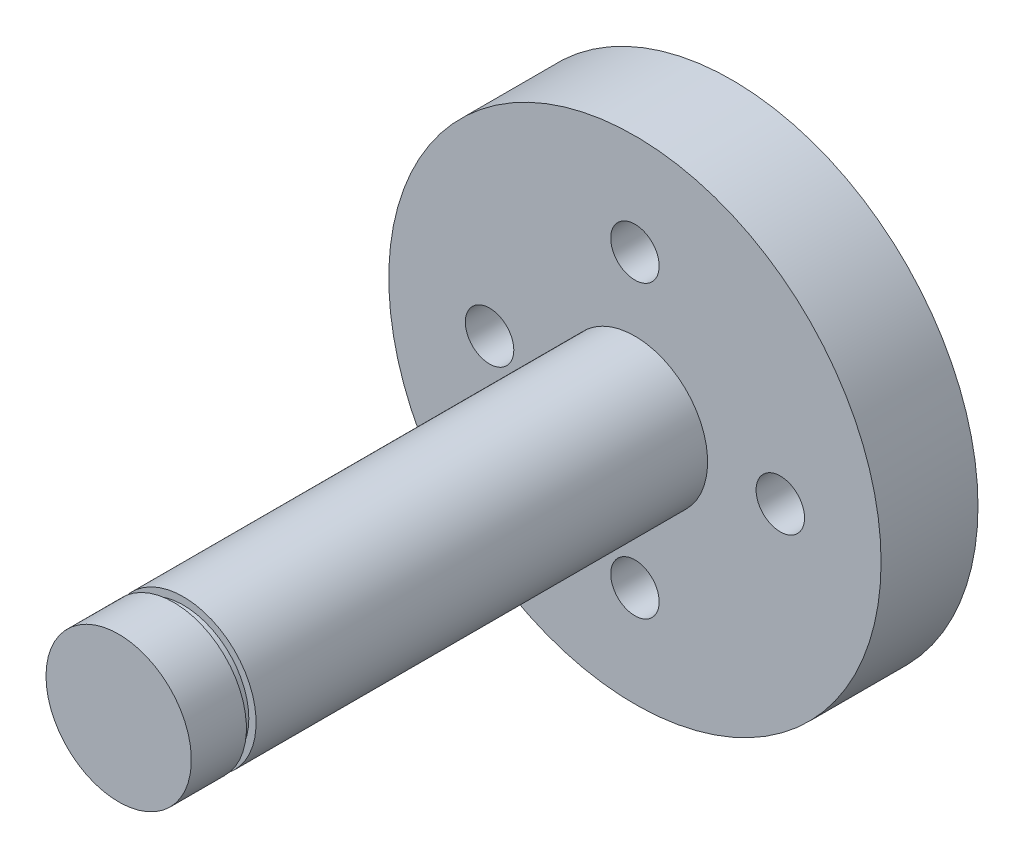
ISO-10303-21;
HEADER;
FILE_DESCRIPTION(('STEP AP214'),'2;1');
FILE_NAME('part.step','',(''),(''),'','','');
FILE_SCHEMA(('AUTOMOTIVE_DESIGN { 1 0 10303 214 1 1 1 1 }'));
ENDSEC;
DATA;
#1=APPLICATION_CONTEXT('core data for automotive mechanical design processes');
#2=APPLICATION_PROTOCOL_DEFINITION('international standard','automotive_design',2000,#1);
#3=PRODUCT_CONTEXT('',#1,'mechanical');
#4=PRODUCT('Part','Part','',(#3));
#5=PRODUCT_RELATED_PRODUCT_CATEGORY('part','',(#4));
#6=PRODUCT_DEFINITION_FORMATION('','',#4);
#7=PRODUCT_DEFINITION_CONTEXT('part definition',#1,'design');
#8=PRODUCT_DEFINITION('design','',#6,#7);
#9=PRODUCT_DEFINITION_SHAPE('','',#8);
#10=(LENGTH_UNIT() NAMED_UNIT(*) SI_UNIT(.MILLI.,.METRE.));
#11=(NAMED_UNIT(*) PLANE_ANGLE_UNIT() SI_UNIT($,.RADIAN.));
#12=(NAMED_UNIT(*) SI_UNIT($,.STERADIAN.) SOLID_ANGLE_UNIT());
#13=UNCERTAINTY_MEASURE_WITH_UNIT(LENGTH_MEASURE(1.E-05),#10,'distance_accuracy_value','');
#14=(GEOMETRIC_REPRESENTATION_CONTEXT(3) GLOBAL_UNCERTAINTY_ASSIGNED_CONTEXT((#13)) GLOBAL_UNIT_ASSIGNED_CONTEXT((#10,
#11,#12)) REPRESENTATION_CONTEXT('',''));
#15=CARTESIAN_POINT('',(0.,0.,0.));
#16=DIRECTION('',(0.,0.,1.));
#17=DIRECTION('',(1.,0.,0.));
#18=AXIS2_PLACEMENT_3D('',#15,#16,#17);
#19=CARTESIAN_POINT('',(0.,0.,63.27));
#20=DIRECTION('',(0.,0.,-1.));
#21=DIRECTION('',(-1.,0.,0.));
#22=AXIS2_PLACEMENT_3D('',#19,#20,#21);
#23=CYLINDRICAL_SURFACE('',#22,7.5);
#24=CARTESIAN_POINT('',(0.,0.,10.));
#25=DIRECTION('',(0.,0.,1.));
#26=DIRECTION('',(1.,0.,0.));
#27=AXIS2_PLACEMENT_3D('',#24,#25,#26);
#28=CIRCLE('',#27,7.5);
#29=CARTESIAN_POINT('',(-7.5,0.,10.));
#30=VERTEX_POINT('',#29);
#31=EDGE_CURVE('E66',#30,#30,#28,.T.);
#32=CARTESIAN_POINT('',(0.,0.,56.59));
#33=DIRECTION('',(0.,0.,1.));
#34=DIRECTION('',(1.,0.,0.));
#35=AXIS2_PLACEMENT_3D('',#32,#33,#34);
#36=CIRCLE('',#35,7.5);
#37=CARTESIAN_POINT('',(-7.5,0.,56.59));
#38=VERTEX_POINT('',#37);
#39=EDGE_CURVE('E60',#38,#38,#36,.T.);
#40=CARTESIAN_POINT('',(-7.5,0.,10.));
#41=CARTESIAN_POINT('',(-7.5,0.,10.4853125));
#42=CARTESIAN_POINT('',(-7.5,0.,10.970625));
#43=CARTESIAN_POINT('',(-7.5,0.,11.94125));
#44=CARTESIAN_POINT('',(-7.5,0.,12.4265625));
#45=CARTESIAN_POINT('',(-7.5,0.,13.3971875));
#46=CARTESIAN_POINT('',(-7.5,0.,13.8825));
#47=CARTESIAN_POINT('',(-7.5,0.,14.853125));
#48=CARTESIAN_POINT('',(-7.5,0.,15.3384375));
#49=CARTESIAN_POINT('',(-7.5,0.,16.3090625));
#50=CARTESIAN_POINT('',(-7.5,0.,16.794375));
#51=CARTESIAN_POINT('',(-7.5,0.,17.765));
#52=CARTESIAN_POINT('',(-7.5,0.,18.2503125));
#53=CARTESIAN_POINT('',(-7.5,0.,19.2209375));
#54=CARTESIAN_POINT('',(-7.5,0.,19.70625));
#55=CARTESIAN_POINT('',(-7.5,0.,20.676875));
#56=CARTESIAN_POINT('',(-7.5,0.,21.1621875));
#57=CARTESIAN_POINT('',(-7.5,0.,22.1328125));
#58=CARTESIAN_POINT('',(-7.5,0.,22.618125));
#59=CARTESIAN_POINT('',(-7.5,0.,23.58875));
#60=CARTESIAN_POINT('',(-7.5,0.,24.0740625));
#61=CARTESIAN_POINT('',(-7.5,0.,25.0446875));
#62=CARTESIAN_POINT('',(-7.5,0.,25.53));
#63=CARTESIAN_POINT('',(-7.5,0.,26.500625));
#64=CARTESIAN_POINT('',(-7.5,0.,26.9859375));
#65=CARTESIAN_POINT('',(-7.5,0.,27.9565625));
#66=CARTESIAN_POINT('',(-7.5,0.,28.441875));
#67=CARTESIAN_POINT('',(-7.5,0.,29.4125));
#68=CARTESIAN_POINT('',(-7.5,0.,29.8978125));
#69=CARTESIAN_POINT('',(-7.5,0.,30.8684375));
#70=CARTESIAN_POINT('',(-7.5,0.,31.35375));
#71=CARTESIAN_POINT('',(-7.5,0.,32.324375));
#72=CARTESIAN_POINT('',(-7.5,0.,32.8096875));
#73=CARTESIAN_POINT('',(-7.5,0.,33.7803125));
#74=CARTESIAN_POINT('',(-7.5,0.,34.265625));
#75=CARTESIAN_POINT('',(-7.5,0.,35.23625));
#76=CARTESIAN_POINT('',(-7.5,0.,35.7215625));
#77=CARTESIAN_POINT('',(-7.5,0.,36.6921875));
#78=CARTESIAN_POINT('',(-7.5,0.,37.1775));
#79=CARTESIAN_POINT('',(-7.5,0.,38.148125));
#80=CARTESIAN_POINT('',(-7.5,0.,38.6334375));
#81=CARTESIAN_POINT('',(-7.5,0.,39.6040625));
#82=CARTESIAN_POINT('',(-7.5,0.,40.089375));
#83=CARTESIAN_POINT('',(-7.5,0.,41.06));
#84=CARTESIAN_POINT('',(-7.5,0.,41.5453125));
#85=CARTESIAN_POINT('',(-7.5,0.,42.5159375));
#86=CARTESIAN_POINT('',(-7.5,0.,43.00125));
#87=CARTESIAN_POINT('',(-7.5,0.,43.971875));
#88=CARTESIAN_POINT('',(-7.5,0.,44.4571875));
#89=CARTESIAN_POINT('',(-7.5,0.,45.4278125));
#90=CARTESIAN_POINT('',(-7.5,0.,45.913125));
#91=CARTESIAN_POINT('',(-7.5,0.,46.88375));
#92=CARTESIAN_POINT('',(-7.5,0.,47.3690625));
#93=CARTESIAN_POINT('',(-7.5,0.,48.3396875));
#94=CARTESIAN_POINT('',(-7.5,0.,48.825));
#95=CARTESIAN_POINT('',(-7.5,0.,49.795625));
#96=CARTESIAN_POINT('',(-7.5,0.,50.2809375));
#97=CARTESIAN_POINT('',(-7.5,0.,51.2515625));
#98=CARTESIAN_POINT('',(-7.5,0.,51.736875));
#99=CARTESIAN_POINT('',(-7.5,0.,52.7075));
#100=CARTESIAN_POINT('',(-7.5,0.,53.1928125));
#101=CARTESIAN_POINT('',(-7.5,0.,54.1634375));
#102=CARTESIAN_POINT('',(-7.5,0.,54.64875));
#103=CARTESIAN_POINT('',(-7.5,0.,55.619375));
#104=CARTESIAN_POINT('',(-7.5,0.,56.1046875));
#105=CARTESIAN_POINT('',(-7.5,0.,56.59));
#106=B_SPLINE_CURVE_WITH_KNOTS('',3,(#40,#41,#42,#43,#44,#45,#46,#47,#48,#49,#50,#51,#52,#53,
#54,#55,#56,#57,#58,#59,#60,#61,#62,#63,#64,#65,#66,#67,#68,#69,#70,#71,#72,#73,#74,#75,#76,#77,
#78,#79,#80,#81,#82,#83,#84,#85,#86,#87,#88,#89,#90,#91,#92,#93,#94,#95,#96,#97,#98,#99,#100,
#101,#102,#103,#104,#105),.UNSPECIFIED.,.F.,.F.,(4,2,2,2,2,2,2,2,2,2,2,2,2,2,2,2,2,2,2,2,2,2,2,
2,2,2,2,2,2,2,2,2,4),(0.,1.4559375,2.911875,4.3678125,5.82375,7.2796875,8.735625,10.1915625,
11.6475,13.1034375,14.559375,16.0153125,17.47125,18.9271875,20.383125,21.8390625,23.295,
24.7509375,26.206875,27.6628125,29.11875,30.5746875,32.030625,33.4865625,34.9425,36.3984375,
37.854375,39.3103125,40.76625,42.2221875,43.678125,45.1340625,46.59),.UNSPECIFIED.);
#107=EDGE_CURVE('BSEAM43',#30,#38,#106,.T.);
#108=ORIENTED_EDGE('',*,*,#31,.T.);
#109=ORIENTED_EDGE('',*,*,#39,.F.);
#110=ORIENTED_EDGE('',*,*,#107,.T.);
#111=ORIENTED_EDGE('',*,*,#107,.F.);
#112=EDGE_LOOP('',(#108,#110,#109,#111));
#113=FACE_BOUND('',#112,.T.);
#114=ADVANCED_FACE('F43',(#113),#23,.T.);
#115=CARTESIAN_POINT('',(0.,0.,10.));
#116=DIRECTION('',(0.,0.,-1.));
#117=DIRECTION('',(-1.,0.,0.));
#118=AXIS2_PLACEMENT_3D('',#115,#116,#117);
#119=CYLINDRICAL_SURFACE('',#118,25.4);
#120=CARTESIAN_POINT('',(0.,0.,10.));
#121=DIRECTION('',(0.,0.,1.));
#122=DIRECTION('',(1.,0.,0.));
#123=AXIS2_PLACEMENT_3D('',#120,#121,#122);
#124=CIRCLE('',#123,25.4);
#125=CARTESIAN_POINT('',(25.4,0.,10.));
#126=VERTEX_POINT('',#125);
#127=EDGE_CURVE('E10',#126,#126,#124,.T.);
#128=ORIENTED_EDGE('',*,*,#127,.F.);
#129=EDGE_LOOP('',(#128));
#130=FACE_BOUND('',#129,.T.);
#131=CARTESIAN_POINT('',(0.,0.,0.));
#132=DIRECTION('',(0.,0.,1.));
#133=DIRECTION('',(1.,0.,0.));
#134=AXIS2_PLACEMENT_3D('',#131,#132,#133);
#135=CIRCLE('',#134,25.4);
#136=CARTESIAN_POINT('',(25.4,0.,0.));
#137=VERTEX_POINT('',#136);
#138=EDGE_CURVE('E51',#137,#137,#135,.T.);
#139=ORIENTED_EDGE('',*,*,#138,.T.);
#140=EDGE_LOOP('',(#139));
#141=FACE_BOUND('',#140,.T.);
#142=ADVANCED_FACE('F45',(#130,#141),#119,.T.);
#143=CARTESIAN_POINT('',(0.,0.,10.));
#144=DIRECTION('',(0.,0.,1.));
#145=DIRECTION('',(1.,0.,0.));
#146=AXIS2_PLACEMENT_3D('',#143,#144,#145);
#147=PLANE('',#146);
#148=ORIENTED_EDGE('',*,*,#31,.F.);
#149=EDGE_LOOP('',(#148));
#150=FACE_BOUND('',#149,.T.);
#151=CARTESIAN_POINT('',(15.,1.57116660247941E-13,10.));
#152=DIRECTION('',(0.,0.,1.));
#153=DIRECTION('',(1.,0.,0.));
#154=AXIS2_PLACEMENT_3D('',#151,#152,#153);
#155=CIRCLE('',#154,2.49999999999999);
#156=CARTESIAN_POINT('',(17.5,1.57116660247941E-13,10.));
#157=VERTEX_POINT('',#156);
#158=EDGE_CURVE('E78',#157,#157,#155,.T.);
#159=ORIENTED_EDGE('',*,*,#158,.F.);
#160=EDGE_LOOP('',(#159));
#161=FACE_BOUND('',#160,.T.);
#162=CARTESIAN_POINT('',(0.,-15.,10.));
#163=DIRECTION('',(0.,0.,1.));
#164=DIRECTION('',(1.,0.,0.));
#165=AXIS2_PLACEMENT_3D('',#162,#163,#164);
#166=CIRCLE('',#165,2.49999999999999);
#167=CARTESIAN_POINT('',(2.49999999999999,-15.,10.));
#168=VERTEX_POINT('',#167);
#169=EDGE_CURVE('E86',#168,#168,#166,.T.);
#170=ORIENTED_EDGE('',*,*,#169,.F.);
#171=EDGE_LOOP('',(#170));
#172=FACE_BOUND('',#171,.T.);
#173=CARTESIAN_POINT('',(-15.,0.,10.));
#174=DIRECTION('',(0.,0.,1.));
#175=DIRECTION('',(1.,0.,0.));
#176=AXIS2_PLACEMENT_3D('',#173,#174,#175);
#177=CIRCLE('',#176,2.49999999999999);
#178=CARTESIAN_POINT('',(-12.5,0.,10.));
#179=VERTEX_POINT('',#178);
#180=EDGE_CURVE('E92',#179,#179,#177,.T.);
#181=ORIENTED_EDGE('',*,*,#180,.F.);
#182=EDGE_LOOP('',(#181));
#183=FACE_BOUND('',#182,.T.);
#184=CARTESIAN_POINT('',(0.,15.,10.));
#185=DIRECTION('',(0.,0.,1.));
#186=DIRECTION('',(1.,0.,0.));
#187=AXIS2_PLACEMENT_3D('',#184,#185,#186);
#188=CIRCLE('',#187,2.49999999999999);
#189=CARTESIAN_POINT('',(2.49999999999999,15.,10.));
#190=VERTEX_POINT('',#189);
#191=EDGE_CURVE('E97',#190,#190,#188,.T.);
#192=ORIENTED_EDGE('',*,*,#191,.F.);
#193=EDGE_LOOP('',(#192));
#194=FACE_BOUND('',#193,.T.);
#195=ORIENTED_EDGE('',*,*,#127,.T.);
#196=EDGE_LOOP('',(#195));
#197=FACE_BOUND('',#196,.T.);
#198=ADVANCED_FACE('F119',(#150,#161,#172,#183,#194,#197),#147,.T.);
#199=CARTESIAN_POINT('',(0.,0.,0.));
#200=DIRECTION('',(0.,0.,1.));
#201=DIRECTION('',(1.,0.,0.));
#202=AXIS2_PLACEMENT_3D('',#199,#200,#201);
#203=PLANE('',#202);
#204=CARTESIAN_POINT('',(15.,1.57116660247941E-13,0.));
#205=DIRECTION('',(0.,0.,1.));
#206=DIRECTION('',(1.,0.,0.));
#207=AXIS2_PLACEMENT_3D('',#204,#205,#206);
#208=CIRCLE('',#207,2.5);
#209=CARTESIAN_POINT('',(17.5,1.57116660247941E-13,0.));
#210=VERTEX_POINT('',#209);
#211=EDGE_CURVE('E83',#210,#210,#208,.T.);
#212=ORIENTED_EDGE('',*,*,#211,.T.);
#213=EDGE_LOOP('',(#212));
#214=FACE_BOUND('',#213,.T.);
#215=CARTESIAN_POINT('',(0.,-15.,0.));
#216=DIRECTION('',(0.,0.,1.));
#217=DIRECTION('',(1.,0.,0.));
#218=AXIS2_PLACEMENT_3D('',#215,#216,#217);
#219=CIRCLE('',#218,2.5);
#220=CARTESIAN_POINT('',(2.5,-15.,0.));
#221=VERTEX_POINT('',#220);
#222=EDGE_CURVE('E89',#221,#221,#219,.T.);
#223=ORIENTED_EDGE('',*,*,#222,.T.);
#224=EDGE_LOOP('',(#223));
#225=FACE_BOUND('',#224,.T.);
#226=CARTESIAN_POINT('',(-15.,0.,0.));
#227=DIRECTION('',(0.,0.,1.));
#228=DIRECTION('',(1.,0.,0.));
#229=AXIS2_PLACEMENT_3D('',#226,#227,#228);
#230=CIRCLE('',#229,2.5);
#231=CARTESIAN_POINT('',(-12.5,0.,0.));
#232=VERTEX_POINT('',#231);
#233=EDGE_CURVE('E95',#232,#232,#230,.T.);
#234=ORIENTED_EDGE('',*,*,#233,.T.);
#235=EDGE_LOOP('',(#234));
#236=FACE_BOUND('',#235,.T.);
#237=CARTESIAN_POINT('',(0.,15.,0.));
#238=DIRECTION('',(0.,0.,1.));
#239=DIRECTION('',(1.,0.,0.));
#240=AXIS2_PLACEMENT_3D('',#237,#238,#239);
#241=CIRCLE('',#240,2.5);
#242=CARTESIAN_POINT('',(2.5,15.,0.));
#243=VERTEX_POINT('',#242);
#244=EDGE_CURVE('E56',#243,#243,#241,.T.);
#245=ORIENTED_EDGE('',*,*,#244,.T.);
#246=EDGE_LOOP('',(#245));
#247=FACE_BOUND('',#246,.T.);
#248=ORIENTED_EDGE('',*,*,#138,.F.);
#249=EDGE_LOOP('',(#248));
#250=FACE_BOUND('',#249,.T.);
#251=ADVANCED_FACE('F104',(#214,#225,#236,#247,#250),#203,.F.);
#252=CARTESIAN_POINT('',(0.,15.,10.));
#253=DIRECTION('',(0.,0.,1.));
#254=DIRECTION('',(1.,0.,0.));
#255=AXIS2_PLACEMENT_3D('',#252,#253,#254);
#256=CYLINDRICAL_SURFACE('',#255,2.49999999999999);
#257=ORIENTED_EDGE('',*,*,#244,.F.);
#258=EDGE_LOOP('',(#257));
#259=FACE_BOUND('',#258,.T.);
#260=ORIENTED_EDGE('',*,*,#191,.T.);
#261=EDGE_LOOP('',(#260));
#262=FACE_BOUND('',#261,.T.);
#263=ADVANCED_FACE('F107',(#259,#262),#256,.F.);
#264=CARTESIAN_POINT('',(-15.,0.,10.));
#265=DIRECTION('',(0.,0.,1.));
#266=DIRECTION('',(1.,0.,0.));
#267=AXIS2_PLACEMENT_3D('',#264,#265,#266);
#268=CYLINDRICAL_SURFACE('',#267,2.49999999999999);
#269=ORIENTED_EDGE('',*,*,#233,.F.);
#270=EDGE_LOOP('',(#269));
#271=FACE_BOUND('',#270,.T.);
#272=ORIENTED_EDGE('',*,*,#180,.T.);
#273=EDGE_LOOP('',(#272));
#274=FACE_BOUND('',#273,.T.);
#275=ADVANCED_FACE('F109',(#271,#274),#268,.F.);
#276=CARTESIAN_POINT('',(0.,-15.,10.));
#277=DIRECTION('',(0.,0.,1.));
#278=DIRECTION('',(1.,0.,0.));
#279=AXIS2_PLACEMENT_3D('',#276,#277,#278);
#280=CYLINDRICAL_SURFACE('',#279,2.49999999999999);
#281=ORIENTED_EDGE('',*,*,#222,.F.);
#282=EDGE_LOOP('',(#281));
#283=FACE_BOUND('',#282,.T.);
#284=ORIENTED_EDGE('',*,*,#169,.T.);
#285=EDGE_LOOP('',(#284));
#286=FACE_BOUND('',#285,.T.);
#287=ADVANCED_FACE('F116',(#283,#286),#280,.F.);
#288=CARTESIAN_POINT('',(15.,1.57116660247941E-13,10.));
#289=DIRECTION('',(0.,0.,1.));
#290=DIRECTION('',(1.,0.,0.));
#291=AXIS2_PLACEMENT_3D('',#288,#289,#290);
#292=CYLINDRICAL_SURFACE('',#291,2.49999999999999);
#293=ORIENTED_EDGE('',*,*,#211,.F.);
#294=EDGE_LOOP('',(#293));
#295=FACE_BOUND('',#294,.T.);
#296=ORIENTED_EDGE('',*,*,#158,.T.);
#297=EDGE_LOOP('',(#296));
#298=FACE_BOUND('',#297,.T.);
#299=ADVANCED_FACE('F148',(#295,#298),#292,.F.);
#300=CARTESIAN_POINT('',(-8.25000000000001,0.,57.59));
#301=DIRECTION('',(0.,0.,-1.));
#302=DIRECTION('',(-1.,0.,0.));
#303=AXIS2_PLACEMENT_3D('',#300,#301,#302);
#304=PLANE('',#303);
#305=CARTESIAN_POINT('',(0.,0.,57.59));
#306=DIRECTION('',(0.,0.,1.));
#307=DIRECTION('',(1.,0.,0.));
#308=AXIS2_PLACEMENT_3D('',#305,#306,#307);
#309=CIRCLE('',#308,6.75000000000001);
#310=CARTESIAN_POINT('',(6.75000000000001,0.,57.59));
#311=VERTEX_POINT('',#310);
#312=EDGE_CURVE('E62',#311,#311,#309,.T.);
#313=ORIENTED_EDGE('',*,*,#312,.T.);
#314=EDGE_LOOP('',(#313));
#315=FACE_BOUND('',#314,.T.);
#316=CARTESIAN_POINT('',(0.,0.,57.59));
#317=DIRECTION('',(0.,0.,-1.));
#318=DIRECTION('',(-1.,0.,0.));
#319=AXIS2_PLACEMENT_3D('',#316,#317,#318);
#320=CIRCLE('',#319,7.5);
#321=CARTESIAN_POINT('',(-7.5,0.,57.59));
#322=VERTEX_POINT('',#321);
#323=EDGE_CURVE('E47',#322,#322,#320,.T.);
#324=ORIENTED_EDGE('',*,*,#323,.T.);
#325=EDGE_LOOP('',(#324));
#326=FACE_BOUND('',#325,.T.);
#327=ADVANCED_FACE('F146',(#315,#326),#304,.T.);
#328=CARTESIAN_POINT('',(-8.25000000000001,0.,56.59));
#329=DIRECTION('',(0.,0.,1.));
#330=DIRECTION('',(1.,0.,0.));
#331=AXIS2_PLACEMENT_3D('',#328,#329,#330);
#332=PLANE('',#331);
#333=CARTESIAN_POINT('',(0.,0.,56.59));
#334=DIRECTION('',(0.,0.,1.));
#335=DIRECTION('',(1.,0.,0.));
#336=AXIS2_PLACEMENT_3D('',#333,#334,#335);
#337=CIRCLE('',#336,6.75000000000001);
#338=CARTESIAN_POINT('',(6.75000000000001,0.,56.59));
#339=VERTEX_POINT('',#338);
#340=EDGE_CURVE('E68',#339,#339,#337,.T.);
#341=ORIENTED_EDGE('',*,*,#340,.F.);
#342=EDGE_LOOP('',(#341));
#343=FACE_BOUND('',#342,.T.);
#344=ORIENTED_EDGE('',*,*,#39,.T.);
#345=EDGE_LOOP('',(#344));
#346=FACE_BOUND('',#345,.T.);
#347=ADVANCED_FACE('F147',(#343,#346),#332,.T.);
#348=CARTESIAN_POINT('',(0.,0.,63.27));
#349=DIRECTION('',(0.,0.,1.));
#350=DIRECTION('',(1.,0.,0.));
#351=AXIS2_PLACEMENT_3D('',#348,#349,#350);
#352=CYLINDRICAL_SURFACE('',#351,6.75000000000001);
#353=ORIENTED_EDGE('',*,*,#340,.T.);
#354=EDGE_LOOP('',(#353));
#355=FACE_BOUND('',#354,.T.);
#356=ORIENTED_EDGE('',*,*,#312,.F.);
#357=EDGE_LOOP('',(#356));
#358=FACE_BOUND('',#357,.T.);
#359=ADVANCED_FACE('F140',(#355,#358),#352,.T.);
#360=CARTESIAN_POINT('',(0.,0.,63.27));
#361=DIRECTION('',(0.,0.,1.));
#362=DIRECTION('',(1.,0.,0.));
#363=AXIS2_PLACEMENT_3D('',#360,#361,#362);
#364=PLANE('',#363);
#365=CARTESIAN_POINT('',(0.,0.,63.27));
#366=DIRECTION('',(0.,0.,1.));
#367=DIRECTION('',(1.,0.,0.));
#368=AXIS2_PLACEMENT_3D('',#365,#366,#367);
#369=CIRCLE('',#368,7.5);
#370=CARTESIAN_POINT('',(-7.5,0.,63.27));
#371=VERTEX_POINT('',#370);
#372=EDGE_CURVE('E75',#371,#371,#369,.T.);
#373=ORIENTED_EDGE('',*,*,#372,.T.);
#374=EDGE_LOOP('',(#373));
#375=FACE_BOUND('',#374,.T.);
#376=ADVANCED_FACE('F135',(#375),#364,.T.);
#377=CARTESIAN_POINT('',(-7.5,0.,63.27));
#378=CARTESIAN_POINT('',(-7.5,0.,63.2108333333333));
#379=CARTESIAN_POINT('',(-7.5,0.,63.1516666666666));
#380=CARTESIAN_POINT('',(-7.5,0.,63.0333333333333));
#381=CARTESIAN_POINT('',(-7.5,0.,62.9741666666666));
#382=CARTESIAN_POINT('',(-7.5,0.,62.8558333333333));
#383=CARTESIAN_POINT('',(-7.5,0.,62.7966666666667));
#384=CARTESIAN_POINT('',(-7.5,0.,62.6783333333333));
#385=CARTESIAN_POINT('',(-7.5,0.,62.6191666666667));
#386=CARTESIAN_POINT('',(-7.5,0.,62.5008333333333));
#387=CARTESIAN_POINT('',(-7.5,0.,62.4416666666667));
#388=CARTESIAN_POINT('',(-7.5,0.,62.3233333333333));
#389=CARTESIAN_POINT('',(-7.5,0.,62.2641666666667));
#390=CARTESIAN_POINT('',(-7.5,0.,62.1458333333333));
#391=CARTESIAN_POINT('',(-7.5,0.,62.0866666666667));
#392=CARTESIAN_POINT('',(-7.5,0.,61.9683333333333));
#393=CARTESIAN_POINT('',(-7.5,0.,61.9091666666667));
#394=CARTESIAN_POINT('',(-7.5,0.,61.7908333333333));
#395=CARTESIAN_POINT('',(-7.5,0.,61.7316666666667));
#396=CARTESIAN_POINT('',(-7.5,0.,61.6133333333333));
#397=CARTESIAN_POINT('',(-7.5,0.,61.5541666666667));
#398=CARTESIAN_POINT('',(-7.5,0.,61.4358333333333));
#399=CARTESIAN_POINT('',(-7.5,0.,61.3766666666667));
#400=CARTESIAN_POINT('',(-7.5,0.,61.2583333333333));
#401=CARTESIAN_POINT('',(-7.5,0.,61.1991666666667));
#402=CARTESIAN_POINT('',(-7.5,0.,61.0808333333333));
#403=CARTESIAN_POINT('',(-7.5,0.,61.0216666666667));
#404=CARTESIAN_POINT('',(-7.5,0.,60.9033333333333));
#405=CARTESIAN_POINT('',(-7.5,0.,60.8441666666667));
#406=CARTESIAN_POINT('',(-7.5,0.,60.7258333333333));
#407=CARTESIAN_POINT('',(-7.5,0.,60.6666666666667));
#408=CARTESIAN_POINT('',(-7.5,0.,60.5483333333333));
#409=CARTESIAN_POINT('',(-7.5,0.,60.4891666666667));
#410=CARTESIAN_POINT('',(-7.5,0.,60.3708333333333));
#411=CARTESIAN_POINT('',(-7.5,0.,60.3116666666667));
#412=CARTESIAN_POINT('',(-7.5,0.,60.1933333333333));
#413=CARTESIAN_POINT('',(-7.5,0.,60.1341666666667));
#414=CARTESIAN_POINT('',(-7.5,0.,60.0158333333333));
#415=CARTESIAN_POINT('',(-7.5,0.,59.9566666666667));
#416=CARTESIAN_POINT('',(-7.5,0.,59.8383333333333));
#417=CARTESIAN_POINT('',(-7.5,0.,59.7791666666667));
#418=CARTESIAN_POINT('',(-7.5,0.,59.6608333333333));
#419=CARTESIAN_POINT('',(-7.5,0.,59.6016666666667));
#420=CARTESIAN_POINT('',(-7.5,0.,59.4833333333333));
#421=CARTESIAN_POINT('',(-7.5,0.,59.4241666666667));
#422=CARTESIAN_POINT('',(-7.5,0.,59.3058333333333));
#423=CARTESIAN_POINT('',(-7.5,0.,59.2466666666667));
#424=CARTESIAN_POINT('',(-7.5,0.,59.1283333333333));
#425=CARTESIAN_POINT('',(-7.5,0.,59.0691666666667));
#426=CARTESIAN_POINT('',(-7.5,0.,58.9508333333333));
#427=CARTESIAN_POINT('',(-7.5,0.,58.8916666666667));
#428=CARTESIAN_POINT('',(-7.5,0.,58.7733333333333));
#429=CARTESIAN_POINT('',(-7.5,0.,58.7141666666667));
#430=CARTESIAN_POINT('',(-7.5,0.,58.5958333333333));
#431=CARTESIAN_POINT('',(-7.5,0.,58.5366666666667));
#432=CARTESIAN_POINT('',(-7.5,0.,58.4183333333333));
#433=CARTESIAN_POINT('',(-7.5,0.,58.3591666666667));
#434=CARTESIAN_POINT('',(-7.5,0.,58.2408333333333));
#435=CARTESIAN_POINT('',(-7.5,0.,58.1816666666667));
#436=CARTESIAN_POINT('',(-7.5,0.,58.0633333333333));
#437=CARTESIAN_POINT('',(-7.5,0.,58.0041666666667));
#438=CARTESIAN_POINT('',(-7.5,0.,57.8858333333333));
#439=CARTESIAN_POINT('',(-7.5,0.,57.8266666666667));
#440=CARTESIAN_POINT('',(-7.5,0.,57.7083333333333));
#441=CARTESIAN_POINT('',(-7.5,0.,57.6491666666667));
#442=CARTESIAN_POINT('',(-7.5,0.,57.59));
#443=B_SPLINE_CURVE_WITH_KNOTS('',3,(#377,#378,#379,#380,#381,#382,#383,#384,#385,#386,#387,
#388,#389,#390,#391,#392,#393,#394,#395,#396,#397,#398,#399,#400,#401,#402,#403,#404,#405,#406,
#407,#408,#409,#410,#411,#412,#413,#414,#415,#416,#417,#418,#419,#420,#421,#422,#423,#424,#425,
#426,#427,#428,#429,#430,#431,#432,#433,#434,#435,#436,#437,#438,#439,#440,#441,#442),
.UNSPECIFIED.,.F.,.F.,(4,2,2,2,2,2,2,2,2,2,2,2,2,2,2,2,2,2,2,2,2,2,2,2,2,2,2,2,2,2,2,2,4),(0.,
0.177500000000011,0.355000000000008,0.532500000000005,0.710000000000002,0.887500000000006,1.065,
1.2425,1.42,1.5975,1.775,1.9525,2.13,2.3075,2.485,2.6625,2.84,3.01749999999999,3.195,
3.37249999999999,3.55,3.72749999999999,3.90499999999999,4.08249999999999,4.25999999999999,
4.43749999999999,4.61499999999999,4.79249999999999,4.96999999999999,5.14749999999999,
5.32499999999999,5.50249999999999,5.67999999999998),.UNSPECIFIED.);
#444=EDGE_CURVE('BSEAM125',#371,#322,#443,.T.);
#445=ORIENTED_EDGE('',*,*,#372,.F.);
#446=ORIENTED_EDGE('',*,*,#323,.F.);
#447=ORIENTED_EDGE('',*,*,#444,.T.);
#448=ORIENTED_EDGE('',*,*,#444,.F.);
#449=EDGE_LOOP('',(#445,#447,#446,#448));
#450=FACE_BOUND('',#449,.T.);
#451=ADVANCED_FACE('F125',(#450),#23,.T.);
#452=CLOSED_SHELL('',(#114,#142,#198,#251,#263,#275,#287,#299,#327,#347,#359,#376,#451));
#453=MANIFOLD_SOLID_BREP('B2',#452);
#454=ADVANCED_BREP_SHAPE_REPRESENTATION('',(#18,#453),#14);
#455=SHAPE_DEFINITION_REPRESENTATION(#9,#454);
ENDSEC;
END-ISO-10303-21;
